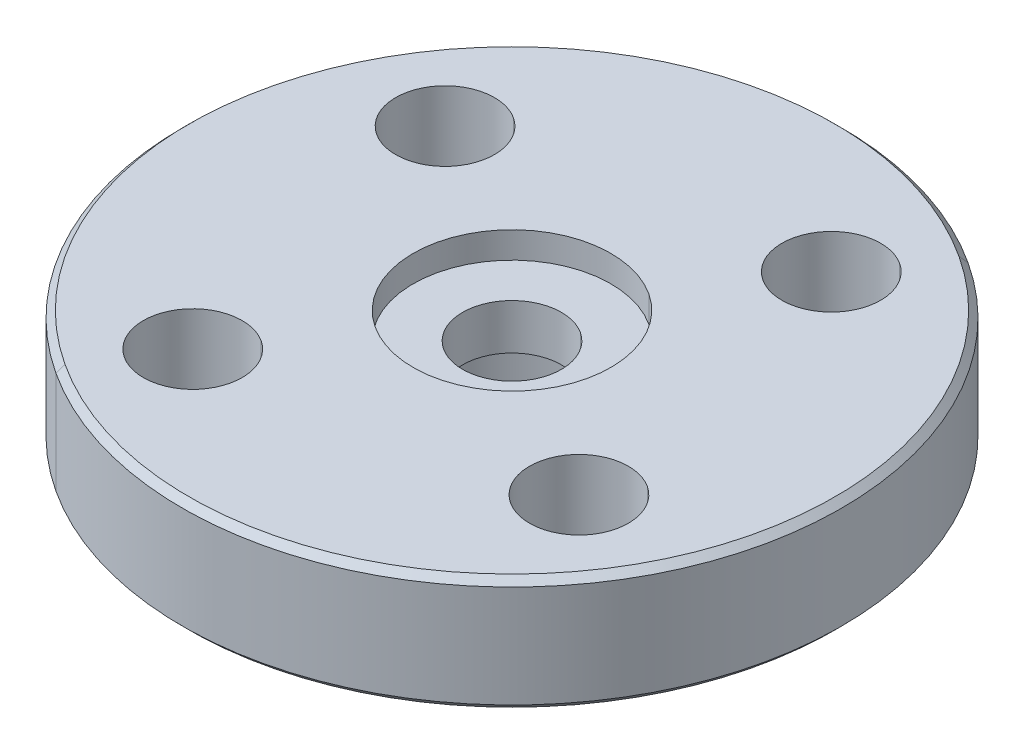
ISO-10303-21;
HEADER;
FILE_DESCRIPTION(('STEP AP214'),'2;1');
FILE_NAME('part.step','',(''),(''),'','','');
FILE_SCHEMA(('AUTOMOTIVE_DESIGN { 1 0 10303 214 1 1 1 1 }'));
ENDSEC;
DATA;
#1=APPLICATION_CONTEXT('core data for automotive mechanical design processes');
#2=APPLICATION_PROTOCOL_DEFINITION('international standard','automotive_design',2000,#1);
#3=PRODUCT_CONTEXT('',#1,'mechanical');
#4=PRODUCT('Part','Part','',(#3));
#5=PRODUCT_RELATED_PRODUCT_CATEGORY('part','',(#4));
#6=PRODUCT_DEFINITION_FORMATION('','',#4);
#7=PRODUCT_DEFINITION_CONTEXT('part definition',#1,'design');
#8=PRODUCT_DEFINITION('design','',#6,#7);
#9=PRODUCT_DEFINITION_SHAPE('','',#8);
#10=(LENGTH_UNIT() NAMED_UNIT(*) SI_UNIT(.MILLI.,.METRE.));
#11=(NAMED_UNIT(*) PLANE_ANGLE_UNIT() SI_UNIT($,.RADIAN.));
#12=(NAMED_UNIT(*) SI_UNIT($,.STERADIAN.) SOLID_ANGLE_UNIT());
#13=UNCERTAINTY_MEASURE_WITH_UNIT(LENGTH_MEASURE(1.E-05),#10,'distance_accuracy_value','');
#14=(GEOMETRIC_REPRESENTATION_CONTEXT(3) GLOBAL_UNCERTAINTY_ASSIGNED_CONTEXT((#13)) GLOBAL_UNIT_ASSIGNED_CONTEXT((#10,
#11,#12)) REPRESENTATION_CONTEXT('',''));
#15=CARTESIAN_POINT('',(0.,0.,0.));
#16=DIRECTION('',(0.,0.,1.));
#17=DIRECTION('',(1.,0.,0.));
#18=AXIS2_PLACEMENT_3D('',#15,#16,#17);
#19=CARTESIAN_POINT('',(-17.2101837303186,-8.246,-3.82860897022792));
#20=DIRECTION('',(0.,1.,0.));
#21=DIRECTION('',(0.546944138603989,0.,-0.837169104331222));
#22=AXIS2_PLACEMENT_3D('',#19,#20,#21);
#23=CYLINDRICAL_SURFACE('',#22,1.5);
#24=CARTESIAN_POINT('',(-17.2101837303186,15.754,-3.82860897022792));
#25=DIRECTION('',(0.,-1.,0.));
#26=DIRECTION('',(-0.546944138603989,0.,0.837169104331222));
#27=AXIS2_PLACEMENT_3D('',#24,#25,#26);
#28=CIRCLE('',#27,1.5);
#29=CARTESIAN_POINT('',(-16.3897675224126,15.754,-5.08436262672476));
#30=VERTEX_POINT('',#29);
#31=CARTESIAN_POINT('',(-18.0305999382245,15.754,-2.57285531373109));
#32=VERTEX_POINT('',#31);
#33=EDGE_CURVE('E11',#30,#32,#28,.T.);
#34=ORIENTED_EDGE('',*,*,#33,.T.);
#35=DIRECTION('',(0.,1.,0.));
#36=VECTOR('',#35,1.);
#37=CARTESIAN_POINT('',(-18.0305999382245,-8.246,-2.57285531373109));
#38=LINE('',#37,#36);
#39=CARTESIAN_POINT('',(-18.0305999382245,19.254,-2.57285531373109));
#40=VERTEX_POINT('',#39);
#41=EDGE_CURVE('E27',#32,#40,#38,.T.);
#42=ORIENTED_EDGE('',*,*,#41,.T.);
#43=CARTESIAN_POINT('',(-17.2101837303186,19.254,-3.82860897022792));
#44=DIRECTION('',(0.,1.,0.));
#45=DIRECTION('',(0.546944138603989,0.,-0.837169104331222));
#46=AXIS2_PLACEMENT_3D('',#43,#44,#45);
#47=CIRCLE('',#46,1.5);
#48=CARTESIAN_POINT('',(-16.3897675224126,19.254,-5.08436262672476));
#49=VERTEX_POINT('',#48);
#50=EDGE_CURVE('E270',#40,#49,#47,.T.);
#51=ORIENTED_EDGE('',*,*,#50,.T.);
#52=DIRECTION('',(0.,1.,0.));
#53=VECTOR('',#52,1.);
#54=CARTESIAN_POINT('',(-16.3897675224126,-8.246,-5.08436262672476));
#55=LINE('',#54,#53);
#56=EDGE_CURVE('E324',#30,#49,#55,.T.);
#57=ORIENTED_EDGE('',*,*,#56,.F.);
#58=EDGE_LOOP('',(#34,#42,#51,#57));
#59=FACE_BOUND('',#58,.T.);
#60=ADVANCED_FACE('F16',(#59),#23,.F.);
#61=CARTESIAN_POINT('',(-7.52139102977208,-8.246,-5.86018373031856));
#62=DIRECTION('',(0.,1.,0.));
#63=DIRECTION('',(0.546944138603989,0.,-0.837169104331222));
#64=AXIS2_PLACEMENT_3D('',#61,#62,#63);
#65=CYLINDRICAL_SURFACE('',#64,1.5);
#66=CARTESIAN_POINT('',(-7.52139102977208,15.754,-5.86018373031856));
#67=DIRECTION('',(0.,-1.,0.));
#68=DIRECTION('',(-0.546944138603989,0.,0.837169104331222));
#69=AXIS2_PLACEMENT_3D('',#66,#67,#68);
#70=CIRCLE('',#69,1.5);
#71=CARTESIAN_POINT('',(-6.70097482186609,15.754,-7.11593738681539));
#72=VERTEX_POINT('',#71);
#73=CARTESIAN_POINT('',(-8.34180723767806,15.754,-4.60443007382172));
#74=VERTEX_POINT('',#73);
#75=EDGE_CURVE('E271',#72,#74,#70,.T.);
#76=ORIENTED_EDGE('',*,*,#75,.T.);
#77=DIRECTION('',(0.,1.,0.));
#78=VECTOR('',#77,1.);
#79=CARTESIAN_POINT('',(-8.34180723767806,-8.246,-4.60443007382172));
#80=LINE('',#79,#78);
#81=CARTESIAN_POINT('',(-8.34180723767806,19.254,-4.60443007382172));
#82=VERTEX_POINT('',#81);
#83=EDGE_CURVE('E275',#74,#82,#80,.T.);
#84=ORIENTED_EDGE('',*,*,#83,.T.);
#85=CARTESIAN_POINT('',(-7.52139102977208,19.254,-5.86018373031856));
#86=DIRECTION('',(0.,1.,0.));
#87=DIRECTION('',(0.546944138603989,0.,-0.837169104331222));
#88=AXIS2_PLACEMENT_3D('',#85,#86,#87);
#89=CIRCLE('',#88,1.5);
#90=CARTESIAN_POINT('',(-6.70097482186609,19.254,-7.11593738681539));
#91=VERTEX_POINT('',#90);
#92=EDGE_CURVE('E292',#82,#91,#89,.T.);
#93=ORIENTED_EDGE('',*,*,#92,.T.);
#94=DIRECTION('',(0.,1.,0.));
#95=VECTOR('',#94,1.);
#96=CARTESIAN_POINT('',(-6.70097482186609,-8.246,-7.11593738681539));
#97=LINE('',#96,#95);
#98=EDGE_CURVE('E451',#72,#91,#97,.T.);
#99=ORIENTED_EDGE('',*,*,#98,.F.);
#100=EDGE_LOOP('',(#76,#84,#93,#99));
#101=FACE_BOUND('',#100,.T.);
#102=ADVANCED_FACE('F509',(#101),#65,.F.);
#103=CARTESIAN_POINT('',(-5.48981626968145,-8.246,3.82860897022792));
#104=DIRECTION('',(0.,1.,0.));
#105=DIRECTION('',(0.546944138603989,0.,-0.837169104331222));
#106=AXIS2_PLACEMENT_3D('',#103,#104,#105);
#107=CYLINDRICAL_SURFACE('',#106,1.5);
#108=CARTESIAN_POINT('',(-5.48981626968145,15.754,3.82860897022792));
#109=DIRECTION('',(0.,-1.,0.));
#110=DIRECTION('',(-0.546944138603989,0.,0.837169104331222));
#111=AXIS2_PLACEMENT_3D('',#108,#109,#110);
#112=CIRCLE('',#111,1.5);
#113=CARTESIAN_POINT('',(-4.66940006177546,15.754,2.57285531373109));
#114=VERTEX_POINT('',#113);
#115=CARTESIAN_POINT('',(-6.31023247758743,15.754,5.08436262672476));
#116=VERTEX_POINT('',#115);
#117=EDGE_CURVE('E343',#114,#116,#112,.T.);
#118=ORIENTED_EDGE('',*,*,#117,.T.);
#119=DIRECTION('',(0.,1.,0.));
#120=VECTOR('',#119,1.);
#121=CARTESIAN_POINT('',(-6.31023247758743,-8.246,5.08436262672476));
#122=LINE('',#121,#120);
#123=CARTESIAN_POINT('',(-6.31023247758743,19.254,5.08436262672476));
#124=VERTEX_POINT('',#123);
#125=EDGE_CURVE('E350',#116,#124,#122,.T.);
#126=ORIENTED_EDGE('',*,*,#125,.T.);
#127=CARTESIAN_POINT('',(-5.48981626968145,19.254,3.82860897022792));
#128=DIRECTION('',(0.,1.,0.));
#129=DIRECTION('',(0.546944138603989,0.,-0.837169104331222));
#130=AXIS2_PLACEMENT_3D('',#127,#128,#129);
#131=CIRCLE('',#130,1.5);
#132=CARTESIAN_POINT('',(-4.66940006177546,19.254,2.57285531373109));
#133=VERTEX_POINT('',#132);
#134=EDGE_CURVE('E266',#124,#133,#131,.T.);
#135=ORIENTED_EDGE('',*,*,#134,.T.);
#136=DIRECTION('',(0.,1.,0.));
#137=VECTOR('',#136,1.);
#138=CARTESIAN_POINT('',(-4.66940006177546,-8.246,2.57285531373109));
#139=LINE('',#138,#137);
#140=EDGE_CURVE('E385',#114,#133,#139,.T.);
#141=ORIENTED_EDGE('',*,*,#140,.F.);
#142=EDGE_LOOP('',(#118,#126,#135,#141));
#143=FACE_BOUND('',#142,.T.);
#144=ADVANCED_FACE('F515',(#143),#107,.F.);
#145=CARTESIAN_POINT('',(-15.1786089702279,-8.246,5.86018373031855));
#146=DIRECTION('',(0.,1.,0.));
#147=DIRECTION('',(0.546944138603989,0.,-0.837169104331222));
#148=AXIS2_PLACEMENT_3D('',#145,#146,#147);
#149=CYLINDRICAL_SURFACE('',#148,1.5);
#150=CARTESIAN_POINT('',(-15.1786089702279,15.754,5.86018373031855));
#151=DIRECTION('',(0.,-1.,0.));
#152=DIRECTION('',(-0.546944138603989,0.,0.837169104331222));
#153=AXIS2_PLACEMENT_3D('',#150,#151,#152);
#154=CIRCLE('',#153,1.5);
#155=CARTESIAN_POINT('',(-14.3581927623219,15.754,4.60443007382172));
#156=VERTEX_POINT('',#155);
#157=CARTESIAN_POINT('',(-15.9990251781339,15.754,7.11593738681539));
#158=VERTEX_POINT('',#157);
#159=EDGE_CURVE('E263',#156,#158,#154,.T.);
#160=ORIENTED_EDGE('',*,*,#159,.T.);
#161=DIRECTION('',(0.,1.,0.));
#162=VECTOR('',#161,1.);
#163=CARTESIAN_POINT('',(-15.9990251781339,-8.246,7.11593738681539));
#164=LINE('',#163,#162);
#165=CARTESIAN_POINT('',(-15.9990251781339,19.254,7.11593738681539));
#166=VERTEX_POINT('',#165);
#167=EDGE_CURVE('E267',#158,#166,#164,.T.);
#168=ORIENTED_EDGE('',*,*,#167,.T.);
#169=CARTESIAN_POINT('',(-15.1786089702279,19.254,5.86018373031855));
#170=DIRECTION('',(0.,1.,0.));
#171=DIRECTION('',(0.546944138603989,0.,-0.837169104331222));
#172=AXIS2_PLACEMENT_3D('',#169,#170,#171);
#173=CIRCLE('',#172,1.5);
#174=CARTESIAN_POINT('',(-14.3581927623219,19.254,4.60443007382172));
#175=VERTEX_POINT('',#174);
#176=EDGE_CURVE('E319',#166,#175,#173,.T.);
#177=ORIENTED_EDGE('',*,*,#176,.T.);
#178=DIRECTION('',(0.,1.,0.));
#179=VECTOR('',#178,1.);
#180=CARTESIAN_POINT('',(-14.3581927623219,-8.246,4.60443007382172));
#181=LINE('',#180,#179);
#182=EDGE_CURVE('E335',#156,#175,#181,.T.);
#183=ORIENTED_EDGE('',*,*,#182,.F.);
#184=EDGE_LOOP('',(#160,#168,#177,#183));
#185=FACE_BOUND('',#184,.T.);
#186=ADVANCED_FACE('F576',(#185),#149,.F.);
#187=CARTESIAN_POINT('',(-11.35,14.254,0.));
#188=DIRECTION('',(0.,-1.,0.));
#189=DIRECTION('',(-0.546944138603989,0.,0.837169104331222));
#190=AXIS2_PLACEMENT_3D('',#187,#188,#189);
#191=CONICAL_SURFACE('',#190,3.29583299261476,0.785398163397448);
#192=CARTESIAN_POINT('',(-11.35,14.254,0.));
#193=DIRECTION('',(0.,-1.,0.));
#194=DIRECTION('',(-0.546944138603989,0.,0.837169104331222));
#195=AXIS2_PLACEMENT_3D('',#192,#193,#194);
#196=CIRCLE('',#195,3.29583299261476);
#197=CARTESIAN_POINT('',(-9.54736346287171,14.254,-2.75916955445259));
#198=VERTEX_POINT('',#197);
#199=CARTESIAN_POINT('',(-13.1526365371283,14.254,2.75916955445259));
#200=VERTEX_POINT('',#199);
#201=EDGE_CURVE('E403',#198,#200,#196,.T.);
#202=ORIENTED_EDGE('',*,*,#201,.F.);
#203=DIRECTION('',(0.386747909337115,-0.707106781186549,-0.591967950672475));
#204=VECTOR('',#203,1.);
#205=CARTESIAN_POINT('',(-9.54736346287171,14.254,-2.75916955445259));
#206=LINE('',#205,#204);
#207=CARTESIAN_POINT('',(-9.27389139356971,13.754,-3.17775410661822));
#208=VERTEX_POINT('',#207);
#209=EDGE_CURVE('E323',#198,#208,#206,.T.);
#210=ORIENTED_EDGE('',*,*,#209,.T.);
#211=CARTESIAN_POINT('',(-11.35,13.754,0.));
#212=DIRECTION('',(0.,1.,0.));
#213=DIRECTION('',(-0.546944138603989,0.,0.837169104331222));
#214=AXIS2_PLACEMENT_3D('',#211,#212,#213);
#215=CIRCLE('',#214,3.79583299261478);
#216=CARTESIAN_POINT('',(-13.4261086064303,13.754,3.17775410661822));
#217=VERTEX_POINT('',#216);
#218=EDGE_CURVE('E279',#217,#208,#215,.T.);
#219=ORIENTED_EDGE('',*,*,#218,.F.);
#220=DIRECTION('',(-0.386747909337115,-0.707106781186549,0.591967950672475));
#221=VECTOR('',#220,1.);
#222=CARTESIAN_POINT('',(-13.1526365371283,14.254,2.75916955445259));
#223=LINE('',#222,#221);
#224=EDGE_CURVE('E354',#200,#217,#223,.T.);
#225=ORIENTED_EDGE('',*,*,#224,.F.);
#226=EDGE_LOOP('',(#202,#210,#219,#225));
#227=FACE_BOUND('',#226,.T.);
#228=ADVANCED_FACE('F578',(#227),#191,.F.);
#229=CARTESIAN_POINT('',(-11.35,17.074,0.));
#230=DIRECTION('',(0.,-1.,0.));
#231=DIRECTION('',(-0.546944138603989,0.,0.837169104331222));
#232=AXIS2_PLACEMENT_3D('',#229,#230,#231);
#233=CYLINDRICAL_SURFACE('',#232,3.29583299261476);
#234=CARTESIAN_POINT('',(-11.35,17.074,0.));
#235=DIRECTION('',(0.,-1.,0.));
#236=DIRECTION('',(-0.546944138603989,0.,0.837169104331222));
#237=AXIS2_PLACEMENT_3D('',#234,#235,#236);
#238=CIRCLE('',#237,3.29583299261476);
#239=CARTESIAN_POINT('',(-9.54736346287171,17.074,-2.75916955445259));
#240=VERTEX_POINT('',#239);
#241=CARTESIAN_POINT('',(-13.1526365371283,17.074,2.75916955445259));
#242=VERTEX_POINT('',#241);
#243=EDGE_CURVE('E311',#240,#242,#238,.T.);
#244=ORIENTED_EDGE('',*,*,#243,.F.);
#245=DIRECTION('',(0.,-1.,0.));
#246=VECTOR('',#245,1.);
#247=CARTESIAN_POINT('',(-9.54736346287171,17.074,-2.75916955445259));
#248=LINE('',#247,#246);
#249=EDGE_CURVE('E399',#240,#198,#248,.T.);
#250=ORIENTED_EDGE('',*,*,#249,.T.);
#251=ORIENTED_EDGE('',*,*,#201,.T.);
#252=DIRECTION('',(0.,-1.,0.));
#253=VECTOR('',#252,1.);
#254=CARTESIAN_POINT('',(-13.1526365371283,17.074,2.75916955445259));
#255=LINE('',#254,#253);
#256=EDGE_CURVE('E360',#242,#200,#255,.T.);
#257=ORIENTED_EDGE('',*,*,#256,.F.);
#258=EDGE_LOOP('',(#244,#250,#251,#257));
#259=FACE_BOUND('',#258,.T.);
#260=ADVANCED_FACE('F584',(#259),#233,.F.);
#261=CARTESIAN_POINT('',(-11.35,18.454,0.));
#262=DIRECTION('',(0.,1.,0.));
#263=DIRECTION('',(0.546944138603989,0.,-0.837169104331222));
#264=AXIS2_PLACEMENT_3D('',#261,#262,#263);
#265=CYLINDRICAL_SURFACE('',#264,3.);
#266=CARTESIAN_POINT('',(-11.35,18.454,0.));
#267=DIRECTION('',(0.,1.,0.));
#268=DIRECTION('',(0.546944138603989,0.,-0.837169104331222));
#269=AXIS2_PLACEMENT_3D('',#266,#267,#268);
#270=CIRCLE('',#269,3.);
#271=CARTESIAN_POINT('',(-12.990832415812,18.454,2.51150731299367));
#272=VERTEX_POINT('',#271);
#273=CARTESIAN_POINT('',(-9.70916758418803,18.454,-2.51150731299367));
#274=VERTEX_POINT('',#273);
#275=EDGE_CURVE('E283',#272,#274,#270,.T.);
#276=ORIENTED_EDGE('',*,*,#275,.F.);
#277=DIRECTION('',(0.,1.,0.));
#278=VECTOR('',#277,1.);
#279=CARTESIAN_POINT('',(-12.990832415812,18.454,2.51150731299367));
#280=LINE('',#279,#278);
#281=CARTESIAN_POINT('',(-12.990832415812,19.254,2.51150731299367));
#282=VERTEX_POINT('',#281);
#283=EDGE_CURVE('E377',#272,#282,#280,.T.);
#284=ORIENTED_EDGE('',*,*,#283,.T.);
#285=CARTESIAN_POINT('',(-11.35,19.254,0.));
#286=DIRECTION('',(0.,1.,0.));
#287=DIRECTION('',(0.546944138603989,0.,-0.837169104331222));
#288=AXIS2_PLACEMENT_3D('',#285,#286,#287);
#289=CIRCLE('',#288,3.);
#290=CARTESIAN_POINT('',(-9.70916758418803,19.254,-2.51150731299367));
#291=VERTEX_POINT('',#290);
#292=EDGE_CURVE('E373',#282,#291,#289,.T.);
#293=ORIENTED_EDGE('',*,*,#292,.T.);
#294=DIRECTION('',(0.,1.,0.));
#295=VECTOR('',#294,1.);
#296=CARTESIAN_POINT('',(-9.70916758418803,18.454,-2.51150731299367));
#297=LINE('',#296,#295);
#298=EDGE_CURVE('E306',#274,#291,#297,.T.);
#299=ORIENTED_EDGE('',*,*,#298,.F.);
#300=EDGE_LOOP('',(#276,#284,#293,#299));
#301=FACE_BOUND('',#300,.T.);
#302=ADVANCED_FACE('F550',(#301),#265,.F.);
#303=CARTESIAN_POINT('',(-11.35,13.754,0.));
#304=DIRECTION('',(0.,1.,0.));
#305=DIRECTION('',(0.546944138603989,0.,-0.837169104331222));
#306=AXIS2_PLACEMENT_3D('',#303,#304,#305);
#307=CONICAL_SURFACE('',#306,4.3,0.785398163397446);
#308=CARTESIAN_POINT('',(-11.35,13.754,0.));
#309=DIRECTION('',(0.,-1.,0.));
#310=DIRECTION('',(-0.546944138603989,0.,0.837169104331222));
#311=AXIS2_PLACEMENT_3D('',#308,#309,#310);
#312=CIRCLE('',#311,4.3);
#313=CARTESIAN_POINT('',(-13.7018597959972,13.754,3.59982714862425));
#314=VERTEX_POINT('',#313);
#315=CARTESIAN_POINT('',(-8.99814020400285,13.754,-3.59982714862425));
#316=VERTEX_POINT('',#315);
#317=EDGE_CURVE('E334',#314,#316,#312,.T.);
#318=ORIENTED_EDGE('',*,*,#317,.F.);
#319=DIRECTION('',(-0.386747909337115,0.707106781186549,0.591967950672474));
#320=VECTOR('',#319,1.);
#321=CARTESIAN_POINT('',(-13.7018597959972,13.754,3.59982714862425));
#322=LINE('',#321,#320);
#323=CARTESIAN_POINT('',(-13.811248623718,13.954,3.7672609694905));
#324=VERTEX_POINT('',#323);
#325=EDGE_CURVE('E288',#314,#324,#322,.T.);
#326=ORIENTED_EDGE('',*,*,#325,.T.);
#327=CARTESIAN_POINT('',(-11.35,13.954,0.));
#328=DIRECTION('',(0.,1.,0.));
#329=DIRECTION('',(-0.546944138603989,0.,0.837169104331222));
#330=AXIS2_PLACEMENT_3D('',#327,#328,#329);
#331=CIRCLE('',#330,4.5);
#332=CARTESIAN_POINT('',(-8.88875137628205,13.954,-3.7672609694905));
#333=VERTEX_POINT('',#332);
#334=EDGE_CURVE('E293',#333,#324,#331,.T.);
#335=ORIENTED_EDGE('',*,*,#334,.F.);
#336=DIRECTION('',(0.386747909337115,0.707106781186549,-0.591967950672474));
#337=VECTOR('',#336,1.);
#338=CARTESIAN_POINT('',(-8.99814020400285,13.754,-3.59982714862425));
#339=LINE('',#338,#337);
#340=EDGE_CURVE('E180',#316,#333,#339,.T.);
#341=ORIENTED_EDGE('',*,*,#340,.F.);
#342=EDGE_LOOP('',(#318,#326,#335,#341));
#343=FACE_BOUND('',#342,.T.);
#344=ADVANCED_FACE('F490',(#343),#307,.T.);
#345=CARTESIAN_POINT('',(-11.35,19.054,0.));
#346=DIRECTION('',(0.,-1.,0.));
#347=DIRECTION('',(-0.546944138603989,0.,0.837169104331222));
#348=AXIS2_PLACEMENT_3D('',#345,#346,#347);
#349=CONICAL_SURFACE('',#348,10.,0.785398163397452);
#350=CARTESIAN_POINT('',(-11.35,19.254,0.));
#351=DIRECTION('',(0.,1.,0.));
#352=DIRECTION('',(-0.546944138603989,0.,0.837169104331222));
#353=AXIS2_PLACEMENT_3D('',#350,#351,#352);
#354=CIRCLE('',#353,9.8);
#355=CARTESIAN_POINT('',(-5.98994744168091,19.254,-8.20425722244598));
#356=VERTEX_POINT('',#355);
#357=CARTESIAN_POINT('',(-16.7100525583191,19.254,8.20425722244598));
#358=VERTEX_POINT('',#357);
#359=EDGE_CURVE('E190',#356,#358,#354,.T.);
#360=ORIENTED_EDGE('',*,*,#359,.F.);
#361=DIRECTION('',(0.386747909337117,-0.707106781186545,-0.591967950672478));
#362=VECTOR('',#361,1.);
#363=CARTESIAN_POINT('',(-5.88055861396011,19.054,-8.37169104331222));
#364=LINE('',#363,#362);
#365=CARTESIAN_POINT('',(-5.88055861396011,19.054,-8.37169104331222));
#366=VERTEX_POINT('',#365);
#367=EDGE_CURVE('E285',#356,#366,#364,.T.);
#368=ORIENTED_EDGE('',*,*,#367,.T.);
#369=CARTESIAN_POINT('',(-11.35,19.054,0.));
#370=DIRECTION('',(0.,-1.,0.));
#371=DIRECTION('',(-0.546944138603989,0.,0.837169104331222));
#372=AXIS2_PLACEMENT_3D('',#369,#370,#371);
#373=CIRCLE('',#372,10.);
#374=CARTESIAN_POINT('',(-16.8194413860399,19.054,8.37169104331222));
#375=VERTEX_POINT('',#374);
#376=EDGE_CURVE('E372',#375,#366,#373,.T.);
#377=ORIENTED_EDGE('',*,*,#376,.F.);
#378=DIRECTION('',(-0.386747909337118,-0.707106781186545,0.591967950672478));
#379=VECTOR('',#378,1.);
#380=CARTESIAN_POINT('',(-16.8194413860399,19.054,8.37169104331222));
#381=LINE('',#380,#379);
#382=EDGE_CURVE('E239',#358,#375,#381,.T.);
#383=ORIENTED_EDGE('',*,*,#382,.F.);
#384=EDGE_LOOP('',(#360,#368,#377,#383));
#385=FACE_BOUND('',#384,.T.);
#386=ADVANCED_FACE('F603',(#385),#349,.T.);
#387=CARTESIAN_POINT('',(-11.35,15.754,0.));
#388=DIRECTION('',(0.,1.,0.));
#389=DIRECTION('',(0.546944138603989,0.,-0.837169104331222));
#390=AXIS2_PLACEMENT_3D('',#387,#388,#389);
#391=CONICAL_SURFACE('',#390,9.8,0.785398163397457);
#392=CARTESIAN_POINT('',(-11.35,15.754,0.));
#393=DIRECTION('',(0.,-1.,0.));
#394=DIRECTION('',(-0.546944138603989,0.,0.837169104331222));
#395=AXIS2_PLACEMENT_3D('',#392,#393,#394);
#396=CIRCLE('',#395,9.8);
#397=CARTESIAN_POINT('',(-16.7100525583191,15.754,8.20425722244598));
#398=VERTEX_POINT('',#397);
#399=CARTESIAN_POINT('',(-5.98994744168091,15.754,-8.20425722244598));
#400=VERTEX_POINT('',#399);
#401=EDGE_CURVE('E228',#398,#400,#396,.T.);
#402=ORIENTED_EDGE('',*,*,#401,.F.);
#403=DIRECTION('',(-0.386747909337119,0.707106781186542,0.591967950672481));
#404=VECTOR('',#403,1.);
#405=CARTESIAN_POINT('',(-16.7100525583191,15.754,8.20425722244598));
#406=LINE('',#405,#404);
#407=CARTESIAN_POINT('',(-16.8194413860399,15.954,8.37169104331222));
#408=VERTEX_POINT('',#407);
#409=EDGE_CURVE('E250',#398,#408,#406,.T.);
#410=ORIENTED_EDGE('',*,*,#409,.T.);
#411=CARTESIAN_POINT('',(-11.35,15.954,0.));
#412=DIRECTION('',(0.,1.,0.));
#413=DIRECTION('',(-0.546944138603989,0.,0.837169104331222));
#414=AXIS2_PLACEMENT_3D('',#411,#412,#413);
#415=CIRCLE('',#414,10.);
#416=CARTESIAN_POINT('',(-5.88055861396011,15.954,-8.37169104331222));
#417=VERTEX_POINT('',#416);
#418=EDGE_CURVE('E231',#417,#408,#415,.T.);
#419=ORIENTED_EDGE('',*,*,#418,.F.);
#420=DIRECTION('',(0.386747909337119,0.707106781186542,-0.591967950672481));
#421=VECTOR('',#420,1.);
#422=CARTESIAN_POINT('',(-5.98994744168091,15.754,-8.20425722244598));
#423=LINE('',#422,#421);
#424=EDGE_CURVE('E224',#400,#417,#423,.T.);
#425=ORIENTED_EDGE('',*,*,#424,.F.);
#426=EDGE_LOOP('',(#402,#410,#419,#425));
#427=FACE_BOUND('',#426,.T.);
#428=ADVANCED_FACE('F226',(#427),#391,.T.);
#429=CARTESIAN_POINT('',(-11.35,-4.47392206135785,0.));
#430=DIRECTION('',(0.,1.,0.));
#431=DIRECTION('',(0.546944138603989,0.,-0.837169104331222));
#432=AXIS2_PLACEMENT_3D('',#429,#430,#431);
#433=CYLINDRICAL_SURFACE('',#432,4.5);
#434=ORIENTED_EDGE('',*,*,#334,.T.);
#435=DIRECTION('',(0.,1.,0.));
#436=VECTOR('',#435,1.);
#437=CARTESIAN_POINT('',(-13.811248623718,-4.47392206135785,3.7672609694905));
#438=LINE('',#437,#436);
#439=CARTESIAN_POINT('',(-13.811248623718,15.754,3.7672609694905));
#440=VERTEX_POINT('',#439);
#441=EDGE_CURVE('E297',#324,#440,#438,.T.);
#442=ORIENTED_EDGE('',*,*,#441,.T.);
#443=CARTESIAN_POINT('',(-11.35,15.754,0.));
#444=DIRECTION('',(0.,-1.,0.));
#445=DIRECTION('',(-0.546944138603989,0.,0.837169104331222));
#446=AXIS2_PLACEMENT_3D('',#443,#444,#445);
#447=CIRCLE('',#446,4.5);
#448=CARTESIAN_POINT('',(-8.88875137628205,15.754,-3.7672609694905));
#449=VERTEX_POINT('',#448);
#450=EDGE_CURVE('E298',#440,#449,#447,.T.);
#451=ORIENTED_EDGE('',*,*,#450,.T.);
#452=DIRECTION('',(0.,1.,0.));
#453=VECTOR('',#452,1.);
#454=CARTESIAN_POINT('',(-8.88875137628205,-4.47392206135785,-3.7672609694905));
#455=LINE('',#454,#453);
#456=EDGE_CURVE('E318',#333,#449,#455,.T.);
#457=ORIENTED_EDGE('',*,*,#456,.F.);
#458=EDGE_LOOP('',(#434,#442,#451,#457));
#459=FACE_BOUND('',#458,.T.);
#460=ADVANCED_FACE('F487',(#459),#433,.T.);
#461=CARTESIAN_POINT('',(-11.35,15.754,0.));
#462=DIRECTION('',(0.,1.,0.));
#463=DIRECTION('',(0.546944138603989,0.,-0.837169104331222));
#464=AXIS2_PLACEMENT_3D('',#461,#462,#463);
#465=CYLINDRICAL_SURFACE('',#464,10.);
#466=ORIENTED_EDGE('',*,*,#418,.T.);
#467=DIRECTION('',(0.,1.,0.));
#468=VECTOR('',#467,1.);
#469=CARTESIAN_POINT('',(-16.8194413860399,15.754,8.37169104331222));
#470=LINE('',#469,#468);
#471=EDGE_CURVE('E368',#408,#375,#470,.T.);
#472=ORIENTED_EDGE('',*,*,#471,.T.);
#473=ORIENTED_EDGE('',*,*,#376,.T.);
#474=DIRECTION('',(0.,1.,0.));
#475=VECTOR('',#474,1.);
#476=CARTESIAN_POINT('',(-5.88055861396011,15.754,-8.37169104331222));
#477=LINE('',#476,#475);
#478=EDGE_CURVE('E259',#417,#366,#477,.T.);
#479=ORIENTED_EDGE('',*,*,#478,.F.);
#480=EDGE_LOOP('',(#466,#472,#473,#479));
#481=FACE_BOUND('',#480,.T.);
#482=ADVANCED_FACE('F674',(#481),#465,.T.);
#483=CARTESIAN_POINT('',(-11.35,-76.046,0.));
#484=DIRECTION('',(0.,1.,0.));
#485=DIRECTION('',(0.546944138603989,0.,-0.837169104331222));
#486=AXIS2_PLACEMENT_3D('',#483,#484,#485);
#487=CYLINDRICAL_SURFACE('',#486,1.5);
#488=CARTESIAN_POINT('',(-11.35,17.074,0.));
#489=DIRECTION('',(0.,1.,0.));
#490=DIRECTION('',(-0.546944138603989,0.,0.837169104331222));
#491=AXIS2_PLACEMENT_3D('',#488,#489,#490);
#492=CIRCLE('',#491,1.5);
#493=CARTESIAN_POINT('',(-12.170416207906,17.074,1.25575365649683));
#494=VERTEX_POINT('',#493);
#495=CARTESIAN_POINT('',(-10.529583792094,17.074,-1.25575365649683));
#496=VERTEX_POINT('',#495);
#497=EDGE_CURVE('E312',#494,#496,#492,.T.);
#498=ORIENTED_EDGE('',*,*,#497,.F.);
#499=DIRECTION('',(0.,1.,0.));
#500=VECTOR('',#499,1.);
#501=CARTESIAN_POINT('',(-12.170416207906,-76.046,1.25575365649683));
#502=LINE('',#501,#500);
#503=CARTESIAN_POINT('',(-12.170416207906,18.454,1.25575365649683));
#504=VERTEX_POINT('',#503);
#505=EDGE_CURVE('E419',#494,#504,#502,.T.);
#506=ORIENTED_EDGE('',*,*,#505,.T.);
#507=CARTESIAN_POINT('',(-11.35,18.454,0.));
#508=DIRECTION('',(0.,-1.,0.));
#509=DIRECTION('',(0.546944138603989,0.,-0.837169104331222));
#510=AXIS2_PLACEMENT_3D('',#507,#508,#509);
#511=CIRCLE('',#510,1.5);
#512=CARTESIAN_POINT('',(-10.529583792094,18.454,-1.25575365649683));
#513=VERTEX_POINT('',#512);
#514=EDGE_CURVE('E280',#513,#504,#511,.T.);
#515=ORIENTED_EDGE('',*,*,#514,.F.);
#516=DIRECTION('',(0.,1.,0.));
#517=VECTOR('',#516,1.);
#518=CARTESIAN_POINT('',(-10.529583792094,-76.046,-1.25575365649683));
#519=LINE('',#518,#517);
#520=EDGE_CURVE('E423',#496,#513,#519,.T.);
#521=ORIENTED_EDGE('',*,*,#520,.F.);
#522=EDGE_LOOP('',(#498,#506,#515,#521));
#523=FACE_BOUND('',#522,.T.);
#524=ADVANCED_FACE('F662',(#523),#487,.F.);
#525=CARTESIAN_POINT('',(-11.35,-76.046,0.));
#526=DIRECTION('',(0.,1.,0.));
#527=DIRECTION('',(0.546944138603989,0.,-0.837169104331222));
#528=AXIS2_PLACEMENT_3D('',#525,#526,#527);
#529=CYLINDRICAL_SURFACE('',#528,1.5);
#530=ORIENTED_EDGE('',*,*,#505,.F.);
#531=CARTESIAN_POINT('',(-11.35,17.074,0.));
#532=DIRECTION('',(0.,1.,0.));
#533=DIRECTION('',(-0.546944138603989,0.,0.837169104331222));
#534=AXIS2_PLACEMENT_3D('',#531,#532,#533);
#535=CIRCLE('',#534,1.5);
#536=EDGE_CURVE('E308',#496,#494,#535,.T.);
#537=ORIENTED_EDGE('',*,*,#536,.F.);
#538=ORIENTED_EDGE('',*,*,#520,.T.);
#539=CARTESIAN_POINT('',(-11.35,18.454,0.));
#540=DIRECTION('',(0.,-1.,0.));
#541=DIRECTION('',(0.546944138603989,0.,-0.837169104331222));
#542=AXIS2_PLACEMENT_3D('',#539,#540,#541);
#543=CIRCLE('',#542,1.5);
#544=EDGE_CURVE('E284',#504,#513,#543,.T.);
#545=ORIENTED_EDGE('',*,*,#544,.F.);
#546=EDGE_LOOP('',(#530,#537,#538,#545));
#547=FACE_BOUND('',#546,.T.);
#548=ADVANCED_FACE('F503',(#547),#529,.F.);
#549=CARTESIAN_POINT('',(-11.35,15.754,0.));
#550=DIRECTION('',(0.,1.,0.));
#551=DIRECTION('',(0.546944138603989,0.,-0.837169104331222));
#552=AXIS2_PLACEMENT_3D('',#549,#550,#551);
#553=CYLINDRICAL_SURFACE('',#552,10.);
#554=ORIENTED_EDGE('',*,*,#471,.F.);
#555=CARTESIAN_POINT('',(-11.35,15.954,0.));
#556=DIRECTION('',(0.,1.,0.));
#557=DIRECTION('',(-0.546944138603989,0.,0.837169104331222));
#558=AXIS2_PLACEMENT_3D('',#555,#556,#557);
#559=CIRCLE('',#558,10.);
#560=EDGE_CURVE('E367',#408,#417,#559,.T.);
#561=ORIENTED_EDGE('',*,*,#560,.T.);
#562=ORIENTED_EDGE('',*,*,#478,.T.);
#563=CARTESIAN_POINT('',(-11.35,19.054,0.));
#564=DIRECTION('',(0.,-1.,0.));
#565=DIRECTION('',(-0.546944138603989,0.,0.837169104331222));
#566=AXIS2_PLACEMENT_3D('',#563,#564,#565);
#567=CIRCLE('',#566,10.);
#568=EDGE_CURVE('E252',#366,#375,#567,.T.);
#569=ORIENTED_EDGE('',*,*,#568,.T.);
#570=EDGE_LOOP('',(#554,#561,#562,#569));
#571=FACE_BOUND('',#570,.T.);
#572=ADVANCED_FACE('F494',(#571),#553,.T.);
#573=CARTESIAN_POINT('',(-11.35,15.754,0.));
#574=DIRECTION('',(0.,-1.,0.));
#575=DIRECTION('',(-0.837169104331222,0.,-0.546944138603989));
#576=AXIS2_PLACEMENT_3D('',#573,#574,#575);
#577=PLANE('',#576);
#578=CARTESIAN_POINT('',(-11.35,15.754,0.));
#579=DIRECTION('',(0.,-1.,0.));
#580=DIRECTION('',(-0.546944138603989,0.,0.837169104331222));
#581=AXIS2_PLACEMENT_3D('',#578,#579,#580);
#582=CIRCLE('',#581,9.8);
#583=EDGE_CURVE('E245',#400,#398,#582,.T.);
#584=ORIENTED_EDGE('',*,*,#583,.T.);
#585=ORIENTED_EDGE('',*,*,#401,.T.);
#586=EDGE_LOOP('',(#584,#585));
#587=FACE_BOUND('',#586,.T.);
#588=ORIENTED_EDGE('',*,*,#33,.F.);
#589=CARTESIAN_POINT('',(-17.2101837303186,15.754,-3.82860897022792));
#590=DIRECTION('',(0.,-1.,0.));
#591=DIRECTION('',(-0.546944138603989,0.,0.837169104331222));
#592=AXIS2_PLACEMENT_3D('',#589,#590,#591);
#593=CIRCLE('',#592,1.5);
#594=EDGE_CURVE('E327',#32,#30,#593,.T.);
#595=ORIENTED_EDGE('',*,*,#594,.F.);
#596=EDGE_LOOP('',(#588,#595));
#597=FACE_BOUND('',#596,.T.);
#598=ORIENTED_EDGE('',*,*,#75,.F.);
#599=CARTESIAN_POINT('',(-7.52139102977208,15.754,-5.86018373031856));
#600=DIRECTION('',(0.,-1.,0.));
#601=DIRECTION('',(-0.546944138603989,0.,0.837169104331222));
#602=AXIS2_PLACEMENT_3D('',#599,#600,#601);
#603=CIRCLE('',#602,1.5);
#604=EDGE_CURVE('E428',#74,#72,#603,.T.);
#605=ORIENTED_EDGE('',*,*,#604,.F.);
#606=EDGE_LOOP('',(#598,#605));
#607=FACE_BOUND('',#606,.T.);
#608=ORIENTED_EDGE('',*,*,#117,.F.);
#609=CARTESIAN_POINT('',(-5.48981626968145,15.754,3.82860897022792));
#610=DIRECTION('',(0.,-1.,0.));
#611=DIRECTION('',(-0.546944138603989,0.,0.837169104331222));
#612=AXIS2_PLACEMENT_3D('',#609,#610,#611);
#613=CIRCLE('',#612,1.5);
#614=EDGE_CURVE('E381',#116,#114,#613,.T.);
#615=ORIENTED_EDGE('',*,*,#614,.F.);
#616=EDGE_LOOP('',(#608,#615));
#617=FACE_BOUND('',#616,.T.);
#618=ORIENTED_EDGE('',*,*,#159,.F.);
#619=CARTESIAN_POINT('',(-15.1786089702279,15.754,5.86018373031855));
#620=DIRECTION('',(0.,-1.,0.));
#621=DIRECTION('',(-0.546944138603989,0.,0.837169104331222));
#622=AXIS2_PLACEMENT_3D('',#619,#620,#621);
#623=CIRCLE('',#622,1.5);
#624=EDGE_CURVE('E338',#158,#156,#623,.T.);
#625=ORIENTED_EDGE('',*,*,#624,.F.);
#626=EDGE_LOOP('',(#618,#625));
#627=FACE_BOUND('',#626,.T.);
#628=CARTESIAN_POINT('',(-11.35,15.754,0.));
#629=DIRECTION('',(0.,-1.,0.));
#630=DIRECTION('',(-0.546944138603989,0.,0.837169104331222));
#631=AXIS2_PLACEMENT_3D('',#628,#629,#630);
#632=CIRCLE('',#631,4.5);
#633=EDGE_CURVE('E333',#449,#440,#632,.T.);
#634=ORIENTED_EDGE('',*,*,#633,.F.);
#635=ORIENTED_EDGE('',*,*,#450,.F.);
#636=EDGE_LOOP('',(#634,#635));
#637=FACE_BOUND('',#636,.T.);
#638=ADVANCED_FACE('F243',(#587,#597,#607,#617,#627,#637),#577,.T.);
#639=CARTESIAN_POINT('',(-11.35,19.254,0.));
#640=DIRECTION('',(0.,-1.,0.));
#641=DIRECTION('',(-0.837169104331222,0.,-0.546944138603989));
#642=AXIS2_PLACEMENT_3D('',#639,#640,#641);
#643=PLANE('',#642);
#644=CARTESIAN_POINT('',(-11.35,19.254,0.));
#645=DIRECTION('',(0.,1.,0.));
#646=DIRECTION('',(-0.546944138603989,0.,0.837169104331222));
#647=AXIS2_PLACEMENT_3D('',#644,#645,#646);
#648=CIRCLE('',#647,9.8);
#649=EDGE_CURVE('E247',#358,#356,#648,.T.);
#650=ORIENTED_EDGE('',*,*,#649,.T.);
#651=ORIENTED_EDGE('',*,*,#359,.T.);
#652=EDGE_LOOP('',(#650,#651));
#653=FACE_BOUND('',#652,.T.);
#654=CARTESIAN_POINT('',(-17.2101837303186,19.254,-3.82860897022792));
#655=DIRECTION('',(0.,1.,0.));
#656=DIRECTION('',(0.546944138603989,0.,-0.837169104331222));
#657=AXIS2_PLACEMENT_3D('',#654,#655,#656);
#658=CIRCLE('',#657,1.5);
#659=EDGE_CURVE('E328',#49,#40,#658,.T.);
#660=ORIENTED_EDGE('',*,*,#659,.F.);
#661=ORIENTED_EDGE('',*,*,#50,.F.);
#662=EDGE_LOOP('',(#660,#661));
#663=FACE_BOUND('',#662,.T.);
#664=CARTESIAN_POINT('',(-7.52139102977208,19.254,-5.86018373031856));
#665=DIRECTION('',(0.,1.,0.));
#666=DIRECTION('',(0.546944138603989,0.,-0.837169104331222));
#667=AXIS2_PLACEMENT_3D('',#664,#665,#666);
#668=CIRCLE('',#667,1.5);
#669=EDGE_CURVE('E380',#91,#82,#668,.T.);
#670=ORIENTED_EDGE('',*,*,#669,.F.);
#671=ORIENTED_EDGE('',*,*,#92,.F.);
#672=EDGE_LOOP('',(#670,#671));
#673=FACE_BOUND('',#672,.T.);
#674=CARTESIAN_POINT('',(-5.48981626968145,19.254,3.82860897022792));
#675=DIRECTION('',(0.,1.,0.));
#676=DIRECTION('',(0.546944138603989,0.,-0.837169104331222));
#677=AXIS2_PLACEMENT_3D('',#674,#675,#676);
#678=CIRCLE('',#677,1.5);
#679=EDGE_CURVE('E424',#133,#124,#678,.T.);
#680=ORIENTED_EDGE('',*,*,#679,.F.);
#681=ORIENTED_EDGE('',*,*,#134,.F.);
#682=EDGE_LOOP('',(#680,#681));
#683=FACE_BOUND('',#682,.T.);
#684=CARTESIAN_POINT('',(-15.1786089702279,19.254,5.86018373031855));
#685=DIRECTION('',(0.,1.,0.));
#686=DIRECTION('',(0.546944138603989,0.,-0.837169104331222));
#687=AXIS2_PLACEMENT_3D('',#684,#685,#686);
#688=CIRCLE('',#687,1.5);
#689=EDGE_CURVE('E339',#175,#166,#688,.T.);
#690=ORIENTED_EDGE('',*,*,#689,.F.);
#691=ORIENTED_EDGE('',*,*,#176,.F.);
#692=EDGE_LOOP('',(#690,#691));
#693=FACE_BOUND('',#692,.T.);
#694=CARTESIAN_POINT('',(-11.35,19.254,0.));
#695=DIRECTION('',(0.,1.,0.));
#696=DIRECTION('',(0.546944138603989,0.,-0.837169104331222));
#697=AXIS2_PLACEMENT_3D('',#694,#695,#696);
#698=CIRCLE('',#697,3.);
#699=EDGE_CURVE('E302',#291,#282,#698,.T.);
#700=ORIENTED_EDGE('',*,*,#699,.F.);
#701=ORIENTED_EDGE('',*,*,#292,.F.);
#702=EDGE_LOOP('',(#700,#701));
#703=FACE_BOUND('',#702,.T.);
#704=ADVANCED_FACE('F493',(#653,#663,#673,#683,#693,#703),#643,.F.);
#705=CARTESIAN_POINT('',(-11.35,-4.47392206135785,0.));
#706=DIRECTION('',(0.,1.,0.));
#707=DIRECTION('',(0.546944138603989,0.,-0.837169104331222));
#708=AXIS2_PLACEMENT_3D('',#705,#706,#707);
#709=CYLINDRICAL_SURFACE('',#708,4.5);
#710=ORIENTED_EDGE('',*,*,#441,.F.);
#711=CARTESIAN_POINT('',(-11.35,13.954,0.));
#712=DIRECTION('',(0.,1.,0.));
#713=DIRECTION('',(-0.546944138603989,0.,0.837169104331222));
#714=AXIS2_PLACEMENT_3D('',#711,#712,#713);
#715=CIRCLE('',#714,4.5);
#716=EDGE_CURVE('E314',#324,#333,#715,.T.);
#717=ORIENTED_EDGE('',*,*,#716,.T.);
#718=ORIENTED_EDGE('',*,*,#456,.T.);
#719=ORIENTED_EDGE('',*,*,#633,.T.);
#720=EDGE_LOOP('',(#710,#717,#718,#719));
#721=FACE_BOUND('',#720,.T.);
#722=ADVANCED_FACE('F18',(#721),#709,.T.);
#723=CARTESIAN_POINT('',(-11.35,13.754,0.));
#724=DIRECTION('',(0.,-1.,0.));
#725=DIRECTION('',(-0.837169104331222,0.,-0.546944138603989));
#726=AXIS2_PLACEMENT_3D('',#723,#724,#725);
#727=PLANE('',#726);
#728=CARTESIAN_POINT('',(-11.35,13.754,0.));
#729=DIRECTION('',(0.,-1.,0.));
#730=DIRECTION('',(-0.546944138603989,0.,0.837169104331222));
#731=AXIS2_PLACEMENT_3D('',#728,#729,#730);
#732=CIRCLE('',#731,4.3);
#733=EDGE_CURVE('E329',#316,#314,#732,.T.);
#734=ORIENTED_EDGE('',*,*,#733,.T.);
#735=ORIENTED_EDGE('',*,*,#317,.T.);
#736=EDGE_LOOP('',(#734,#735));
#737=FACE_BOUND('',#736,.T.);
#738=ORIENTED_EDGE('',*,*,#218,.T.);
#739=CARTESIAN_POINT('',(-11.35,13.754,0.));
#740=DIRECTION('',(0.,1.,0.));
#741=DIRECTION('',(-0.546944138603989,0.,0.837169104331222));
#742=AXIS2_PLACEMENT_3D('',#739,#740,#741);
#743=CIRCLE('',#742,3.79583299261478);
#744=EDGE_CURVE('E238',#208,#217,#743,.T.);
#745=ORIENTED_EDGE('',*,*,#744,.T.);
#746=EDGE_LOOP('',(#738,#745));
#747=FACE_BOUND('',#746,.T.);
#748=ADVANCED_FACE('F528',(#737,#747),#727,.T.);
#749=CARTESIAN_POINT('',(-11.35,15.754,0.));
#750=DIRECTION('',(0.,1.,0.));
#751=DIRECTION('',(0.546944138603989,0.,-0.837169104331222));
#752=AXIS2_PLACEMENT_3D('',#749,#750,#751);
#753=CONICAL_SURFACE('',#752,9.8,0.785398163397457);
#754=ORIENTED_EDGE('',*,*,#409,.F.);
#755=ORIENTED_EDGE('',*,*,#583,.F.);
#756=ORIENTED_EDGE('',*,*,#424,.T.);
#757=ORIENTED_EDGE('',*,*,#560,.F.);
#758=EDGE_LOOP('',(#754,#755,#756,#757));
#759=FACE_BOUND('',#758,.T.);
#760=ADVANCED_FACE('F249',(#759),#753,.T.);
#761=CARTESIAN_POINT('',(-11.35,19.054,0.));
#762=DIRECTION('',(0.,-1.,0.));
#763=DIRECTION('',(-0.546944138603989,0.,0.837169104331222));
#764=AXIS2_PLACEMENT_3D('',#761,#762,#763);
#765=CONICAL_SURFACE('',#764,10.,0.785398163397452);
#766=ORIENTED_EDGE('',*,*,#367,.F.);
#767=ORIENTED_EDGE('',*,*,#649,.F.);
#768=ORIENTED_EDGE('',*,*,#382,.T.);
#769=ORIENTED_EDGE('',*,*,#568,.F.);
#770=EDGE_LOOP('',(#766,#767,#768,#769));
#771=FACE_BOUND('',#770,.T.);
#772=ADVANCED_FACE('F519',(#771),#765,.T.);
#773=CARTESIAN_POINT('',(-11.35,13.754,0.));
#774=DIRECTION('',(0.,1.,0.));
#775=DIRECTION('',(0.546944138603989,0.,-0.837169104331222));
#776=AXIS2_PLACEMENT_3D('',#773,#774,#775);
#777=CONICAL_SURFACE('',#776,4.3,0.785398163397446);
#778=ORIENTED_EDGE('',*,*,#325,.F.);
#779=ORIENTED_EDGE('',*,*,#733,.F.);
#780=ORIENTED_EDGE('',*,*,#340,.T.);
#781=ORIENTED_EDGE('',*,*,#716,.F.);
#782=EDGE_LOOP('',(#778,#779,#780,#781));
#783=FACE_BOUND('',#782,.T.);
#784=ADVANCED_FACE('F485',(#783),#777,.T.);
#785=CARTESIAN_POINT('',(-11.35,18.454,0.));
#786=DIRECTION('',(0.,1.,0.));
#787=DIRECTION('',(0.546944138603989,0.,-0.837169104331222));
#788=AXIS2_PLACEMENT_3D('',#785,#786,#787);
#789=PLANE('',#788);
#790=CARTESIAN_POINT('',(-11.35,18.454,0.));
#791=DIRECTION('',(0.,1.,0.));
#792=DIRECTION('',(0.546944138603989,0.,-0.837169104331222));
#793=AXIS2_PLACEMENT_3D('',#790,#791,#792);
#794=CIRCLE('',#793,3.);
#795=EDGE_CURVE('E460',#274,#272,#794,.T.);
#796=ORIENTED_EDGE('',*,*,#795,.T.);
#797=ORIENTED_EDGE('',*,*,#275,.T.);
#798=EDGE_LOOP('',(#796,#797));
#799=FACE_BOUND('',#798,.T.);
#800=ORIENTED_EDGE('',*,*,#514,.T.);
#801=ORIENTED_EDGE('',*,*,#544,.T.);
#802=EDGE_LOOP('',(#800,#801));
#803=FACE_BOUND('',#802,.T.);
#804=ADVANCED_FACE('F526',(#799,#803),#789,.T.);
#805=CARTESIAN_POINT('',(-11.35,18.454,0.));
#806=DIRECTION('',(0.,1.,0.));
#807=DIRECTION('',(0.546944138603989,0.,-0.837169104331222));
#808=AXIS2_PLACEMENT_3D('',#805,#806,#807);
#809=CYLINDRICAL_SURFACE('',#808,3.);
#810=ORIENTED_EDGE('',*,*,#283,.F.);
#811=ORIENTED_EDGE('',*,*,#795,.F.);
#812=ORIENTED_EDGE('',*,*,#298,.T.);
#813=ORIENTED_EDGE('',*,*,#699,.T.);
#814=EDGE_LOOP('',(#810,#811,#812,#813));
#815=FACE_BOUND('',#814,.T.);
#816=ADVANCED_FACE('F546',(#815),#809,.F.);
#817=CARTESIAN_POINT('',(-11.35,17.074,0.));
#818=DIRECTION('',(0.,-1.,0.));
#819=DIRECTION('',(-0.837169104331222,0.,-0.546944138603989));
#820=AXIS2_PLACEMENT_3D('',#817,#818,#819);
#821=PLANE('',#820);
#822=CARTESIAN_POINT('',(-11.35,17.074,0.));
#823=DIRECTION('',(0.,-1.,0.));
#824=DIRECTION('',(-0.546944138603989,0.,0.837169104331222));
#825=AXIS2_PLACEMENT_3D('',#822,#823,#824);
#826=CIRCLE('',#825,3.29583299261476);
#827=EDGE_CURVE('E307',#242,#240,#826,.T.);
#828=ORIENTED_EDGE('',*,*,#827,.T.);
#829=ORIENTED_EDGE('',*,*,#243,.T.);
#830=EDGE_LOOP('',(#828,#829));
#831=FACE_BOUND('',#830,.T.);
#832=ORIENTED_EDGE('',*,*,#536,.T.);
#833=ORIENTED_EDGE('',*,*,#497,.T.);
#834=EDGE_LOOP('',(#832,#833));
#835=FACE_BOUND('',#834,.T.);
#836=ADVANCED_FACE('F590',(#831,#835),#821,.T.);
#837=CARTESIAN_POINT('',(-11.35,17.074,0.));
#838=DIRECTION('',(0.,-1.,0.));
#839=DIRECTION('',(-0.546944138603989,0.,0.837169104331222));
#840=AXIS2_PLACEMENT_3D('',#837,#838,#839);
#841=CYLINDRICAL_SURFACE('',#840,3.29583299261476);
#842=ORIENTED_EDGE('',*,*,#249,.F.);
#843=ORIENTED_EDGE('',*,*,#827,.F.);
#844=ORIENTED_EDGE('',*,*,#256,.T.);
#845=CARTESIAN_POINT('',(-11.35,14.254,0.));
#846=DIRECTION('',(0.,-1.,0.));
#847=DIRECTION('',(-0.546944138603989,0.,0.837169104331222));
#848=AXIS2_PLACEMENT_3D('',#845,#846,#847);
#849=CIRCLE('',#848,3.29583299261476);
#850=EDGE_CURVE('E20',#200,#198,#849,.T.);
#851=ORIENTED_EDGE('',*,*,#850,.T.);
#852=EDGE_LOOP('',(#842,#843,#844,#851));
#853=FACE_BOUND('',#852,.T.);
#854=ADVANCED_FACE('F597',(#853),#841,.F.);
#855=CARTESIAN_POINT('',(-11.35,14.254,0.));
#856=DIRECTION('',(0.,-1.,0.));
#857=DIRECTION('',(-0.546944138603989,0.,0.837169104331222));
#858=AXIS2_PLACEMENT_3D('',#855,#856,#857);
#859=CONICAL_SURFACE('',#858,3.29583299261476,0.785398163397448);
#860=ORIENTED_EDGE('',*,*,#209,.F.);
#861=ORIENTED_EDGE('',*,*,#850,.F.);
#862=ORIENTED_EDGE('',*,*,#224,.T.);
#863=ORIENTED_EDGE('',*,*,#744,.F.);
#864=EDGE_LOOP('',(#860,#861,#862,#863));
#865=FACE_BOUND('',#864,.T.);
#866=ADVANCED_FACE('F600',(#865),#859,.F.);
#867=CARTESIAN_POINT('',(-15.1786089702279,-8.246,5.86018373031855));
#868=DIRECTION('',(0.,1.,0.));
#869=DIRECTION('',(0.546944138603989,0.,-0.837169104331222));
#870=AXIS2_PLACEMENT_3D('',#867,#868,#869);
#871=CYLINDRICAL_SURFACE('',#870,1.5);
#872=ORIENTED_EDGE('',*,*,#167,.F.);
#873=ORIENTED_EDGE('',*,*,#624,.T.);
#874=ORIENTED_EDGE('',*,*,#182,.T.);
#875=ORIENTED_EDGE('',*,*,#689,.T.);
#876=EDGE_LOOP('',(#872,#873,#874,#875));
#877=FACE_BOUND('',#876,.T.);
#878=ADVANCED_FACE('F575',(#877),#871,.F.);
#879=CARTESIAN_POINT('',(-5.48981626968145,-8.246,3.82860897022792));
#880=DIRECTION('',(0.,1.,0.));
#881=DIRECTION('',(0.546944138603989,0.,-0.837169104331222));
#882=AXIS2_PLACEMENT_3D('',#879,#880,#881);
#883=CYLINDRICAL_SURFACE('',#882,1.5);
#884=ORIENTED_EDGE('',*,*,#125,.F.);
#885=ORIENTED_EDGE('',*,*,#614,.T.);
#886=ORIENTED_EDGE('',*,*,#140,.T.);
#887=ORIENTED_EDGE('',*,*,#679,.T.);
#888=EDGE_LOOP('',(#884,#885,#886,#887));
#889=FACE_BOUND('',#888,.T.);
#890=ADVANCED_FACE('F609',(#889),#883,.F.);
#891=CARTESIAN_POINT('',(-7.52139102977208,-8.246,-5.86018373031856));
#892=DIRECTION('',(0.,1.,0.));
#893=DIRECTION('',(0.546944138603989,0.,-0.837169104331222));
#894=AXIS2_PLACEMENT_3D('',#891,#892,#893);
#895=CYLINDRICAL_SURFACE('',#894,1.5);
#896=ORIENTED_EDGE('',*,*,#83,.F.);
#897=ORIENTED_EDGE('',*,*,#604,.T.);
#898=ORIENTED_EDGE('',*,*,#98,.T.);
#899=ORIENTED_EDGE('',*,*,#669,.T.);
#900=EDGE_LOOP('',(#896,#897,#898,#899));
#901=FACE_BOUND('',#900,.T.);
#902=ADVANCED_FACE('F562',(#901),#895,.F.);
#903=CARTESIAN_POINT('',(-17.2101837303186,-8.246,-3.82860897022792));
#904=DIRECTION('',(0.,1.,0.));
#905=DIRECTION('',(0.546944138603989,0.,-0.837169104331222));
#906=AXIS2_PLACEMENT_3D('',#903,#904,#905);
#907=CYLINDRICAL_SURFACE('',#906,1.5);
#908=ORIENTED_EDGE('',*,*,#41,.F.);
#909=ORIENTED_EDGE('',*,*,#594,.T.);
#910=ORIENTED_EDGE('',*,*,#56,.T.);
#911=ORIENTED_EDGE('',*,*,#659,.T.);
#912=EDGE_LOOP('',(#908,#909,#910,#911));
#913=FACE_BOUND('',#912,.T.);
#914=ADVANCED_FACE('F647',(#913),#907,.F.);
#915=CLOSED_SHELL('',(#60,#102,#144,#186,#228,#260,#302,#344,#386,#428,#460,#482,#524,#548,#572,
#638,#704,#722,#748,#760,#772,#784,#804,#816,#836,#854,#866,#878,#890,#902,#914));
#916=MANIFOLD_SOLID_BREP('B1',#915);
#917=ADVANCED_BREP_SHAPE_REPRESENTATION('',(#18,#916),#14);
#918=SHAPE_DEFINITION_REPRESENTATION(#9,#917);
ENDSEC;
END-ISO-10303-21;
